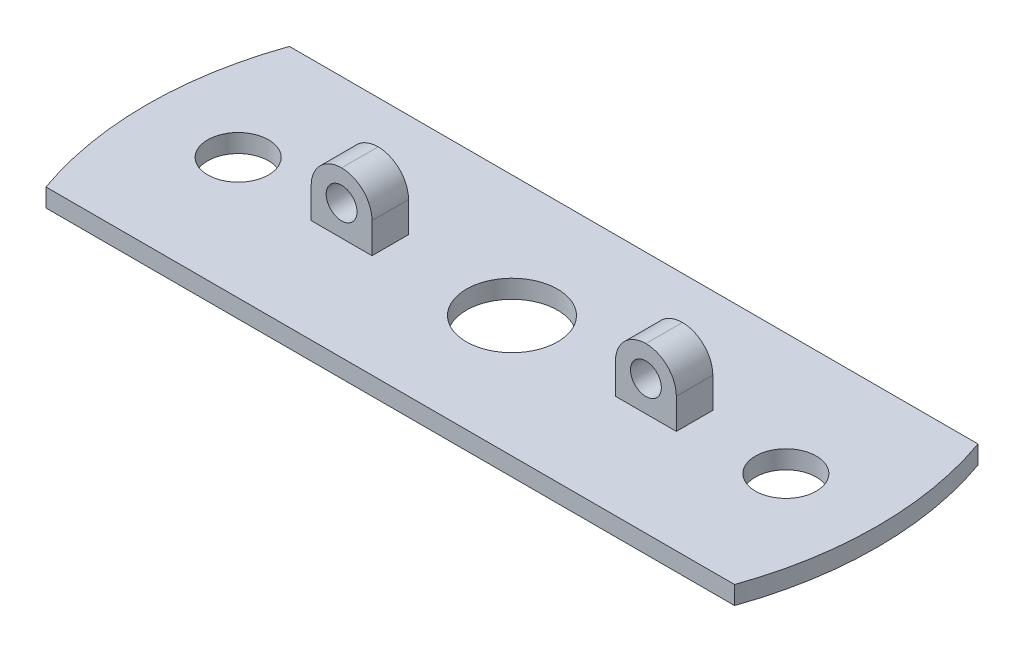
ISO-10303-21;
HEADER;
FILE_DESCRIPTION(('STEP AP214'),'2;1');
FILE_NAME('part.step','',(''),(''),'','','');
FILE_SCHEMA(('AUTOMOTIVE_DESIGN { 1 0 10303 214 1 1 1 1 }'));
ENDSEC;
DATA;
#1=APPLICATION_CONTEXT('core data for automotive mechanical design processes');
#2=APPLICATION_PROTOCOL_DEFINITION('international standard','automotive_design',2000,#1);
#3=PRODUCT_CONTEXT('',#1,'mechanical');
#4=PRODUCT('Part','Part','',(#3));
#5=PRODUCT_RELATED_PRODUCT_CATEGORY('part','',(#4));
#6=PRODUCT_DEFINITION_FORMATION('','',#4);
#7=PRODUCT_DEFINITION_CONTEXT('part definition',#1,'design');
#8=PRODUCT_DEFINITION('design','',#6,#7);
#9=PRODUCT_DEFINITION_SHAPE('','',#8);
#10=(LENGTH_UNIT() NAMED_UNIT(*) SI_UNIT(.MILLI.,.METRE.));
#11=(NAMED_UNIT(*) PLANE_ANGLE_UNIT() SI_UNIT($,.RADIAN.));
#12=(NAMED_UNIT(*) SI_UNIT($,.STERADIAN.) SOLID_ANGLE_UNIT());
#13=UNCERTAINTY_MEASURE_WITH_UNIT(LENGTH_MEASURE(1.E-05),#10,'distance_accuracy_value','');
#14=(GEOMETRIC_REPRESENTATION_CONTEXT(3) GLOBAL_UNCERTAINTY_ASSIGNED_CONTEXT((#13)) GLOBAL_UNIT_ASSIGNED_CONTEXT((#10,
#11,#12)) REPRESENTATION_CONTEXT('',''));
#15=CARTESIAN_POINT('',(0.,0.,0.));
#16=DIRECTION('',(0.,0.,1.));
#17=DIRECTION('',(1.,0.,0.));
#18=AXIS2_PLACEMENT_3D('',#15,#16,#17);
#19=CARTESIAN_POINT('',(0.,3.,0.));
#20=DIRECTION('',(0.,1.,0.));
#21=DIRECTION('',(0.,0.,1.));
#22=AXIS2_PLACEMENT_3D('',#19,#20,#21);
#23=PLANE('',#22);
#24=DIRECTION('',(0.,0.,-1.));
#25=VECTOR('',#24,1.);
#26=CARTESIAN_POINT('',(20.,3.,-3.));
#27=LINE('',#26,#25);
#28=CARTESIAN_POINT('',(20.,3.,3.));
#29=VERTEX_POINT('',#28);
#30=CARTESIAN_POINT('',(20.,3.,-3.));
#31=VERTEX_POINT('',#30);
#32=EDGE_CURVE('E143',#29,#31,#27,.T.);
#33=ORIENTED_EDGE('',*,*,#32,.T.);
#34=DIRECTION('',(1.,0.,0.));
#35=VECTOR('',#34,1.);
#36=CARTESIAN_POINT('',(30.,3.,-3.));
#37=LINE('',#36,#35);
#38=CARTESIAN_POINT('',(30.,3.,-3.));
#39=VERTEX_POINT('',#38);
#40=EDGE_CURVE('E149',#31,#39,#37,.T.);
#41=ORIENTED_EDGE('',*,*,#40,.T.);
#42=DIRECTION('',(0.,0.,1.));
#43=VECTOR('',#42,1.);
#44=CARTESIAN_POINT('',(30.,3.,-3.));
#45=LINE('',#44,#43);
#46=CARTESIAN_POINT('',(30.,3.,3.));
#47=VERTEX_POINT('',#46);
#48=EDGE_CURVE('E162',#39,#47,#45,.T.);
#49=ORIENTED_EDGE('',*,*,#48,.T.);
#50=DIRECTION('',(-1.,0.,0.));
#51=VECTOR('',#50,1.);
#52=CARTESIAN_POINT('',(30.,3.,3.));
#53=LINE('',#52,#51);
#54=EDGE_CURVE('E158',#47,#29,#53,.T.);
#55=ORIENTED_EDGE('',*,*,#54,.T.);
#56=EDGE_LOOP('',(#33,#41,#49,#55));
#57=FACE_BOUND('',#56,.T.);
#58=CARTESIAN_POINT('',(45.,3.,0.));
#59=DIRECTION('',(0.,1.,0.));
#60=DIRECTION('',(0.,0.,1.));
#61=AXIS2_PLACEMENT_3D('',#58,#59,#60);
#62=CIRCLE('',#61,5.);
#63=CARTESIAN_POINT('',(45.,3.,5.));
#64=VERTEX_POINT('',#63);
#65=EDGE_CURVE('E206',#64,#64,#62,.T.);
#66=ORIENTED_EDGE('',*,*,#65,.F.);
#67=EDGE_LOOP('',(#66));
#68=FACE_BOUND('',#67,.T.);
#69=CARTESIAN_POINT('',(0.,3.,0.));
#70=DIRECTION('',(0.,1.,0.));
#71=DIRECTION('',(0.,0.,1.));
#72=AXIS2_PLACEMENT_3D('',#69,#70,#71);
#73=CIRCLE('',#72,60.);
#74=CARTESIAN_POINT('',(-56.5685424949238,3.,-20.));
#75=VERTEX_POINT('',#74);
#76=CARTESIAN_POINT('',(-56.5685424949238,3.,20.));
#77=VERTEX_POINT('',#76);
#78=EDGE_CURVE('E218',#75,#77,#73,.T.);
#79=ORIENTED_EDGE('',*,*,#78,.T.);
#80=DIRECTION('',(1.,0.,0.));
#81=VECTOR('',#80,1.);
#82=CARTESIAN_POINT('',(-56.5685424949238,3.,20.));
#83=LINE('',#82,#81);
#84=CARTESIAN_POINT('',(56.5685424949238,3.,20.));
#85=VERTEX_POINT('',#84);
#86=EDGE_CURVE('E221',#77,#85,#83,.T.);
#87=ORIENTED_EDGE('',*,*,#86,.T.);
#88=CARTESIAN_POINT('',(0.,3.,0.));
#89=DIRECTION('',(0.,1.,0.));
#90=DIRECTION('',(0.,0.,1.));
#91=AXIS2_PLACEMENT_3D('',#88,#89,#90);
#92=CIRCLE('',#91,60.);
#93=CARTESIAN_POINT('',(56.5685424949238,3.,-20.));
#94=VERTEX_POINT('',#93);
#95=EDGE_CURVE('E224',#85,#94,#92,.T.);
#96=ORIENTED_EDGE('',*,*,#95,.T.);
#97=DIRECTION('',(-1.,0.,0.));
#98=VECTOR('',#97,1.);
#99=CARTESIAN_POINT('',(-56.5685424949238,3.,-20.));
#100=LINE('',#99,#98);
#101=EDGE_CURVE('E226',#94,#75,#100,.T.);
#102=ORIENTED_EDGE('',*,*,#101,.T.);
#103=EDGE_LOOP('',(#79,#87,#96,#102));
#104=FACE_BOUND('',#103,.T.);
#105=CARTESIAN_POINT('',(0.,3.,0.));
#106=DIRECTION('',(0.,1.,0.));
#107=DIRECTION('',(0.,0.,1.));
#108=AXIS2_PLACEMENT_3D('',#105,#106,#107);
#109=CIRCLE('',#108,7.5);
#110=CARTESIAN_POINT('',(0.,3.,7.5));
#111=VERTEX_POINT('',#110);
#112=EDGE_CURVE('E212',#111,#111,#109,.T.);
#113=ORIENTED_EDGE('',*,*,#112,.F.);
#114=EDGE_LOOP('',(#113));
#115=FACE_BOUND('',#114,.T.);
#116=CARTESIAN_POINT('',(-45.,3.,0.));
#117=DIRECTION('',(0.,1.,0.));
#118=DIRECTION('',(0.,0.,1.));
#119=AXIS2_PLACEMENT_3D('',#116,#117,#118);
#120=CIRCLE('',#119,5.);
#121=CARTESIAN_POINT('',(-45.,3.,5.));
#122=VERTEX_POINT('',#121);
#123=EDGE_CURVE('E200',#122,#122,#120,.T.);
#124=ORIENTED_EDGE('',*,*,#123,.F.);
#125=EDGE_LOOP('',(#124));
#126=FACE_BOUND('',#125,.T.);
#127=DIRECTION('',(-1.,0.,0.));
#128=VECTOR('',#127,1.);
#129=CARTESIAN_POINT('',(-30.,3.,-3.));
#130=LINE('',#129,#128);
#131=CARTESIAN_POINT('',(-20.,3.,-3.));
#132=VERTEX_POINT('',#131);
#133=CARTESIAN_POINT('',(-30.,3.,-3.));
#134=VERTEX_POINT('',#133);
#135=EDGE_CURVE('E182',#132,#134,#130,.T.);
#136=ORIENTED_EDGE('',*,*,#135,.F.);
#137=DIRECTION('',(0.,0.,-1.));
#138=VECTOR('',#137,1.);
#139=CARTESIAN_POINT('',(-20.,3.,-3.));
#140=LINE('',#139,#138);
#141=CARTESIAN_POINT('',(-20.,3.,3.));
#142=VERTEX_POINT('',#141);
#143=EDGE_CURVE('E179',#142,#132,#140,.T.);
#144=ORIENTED_EDGE('',*,*,#143,.F.);
#145=DIRECTION('',(1.,0.,0.));
#146=VECTOR('',#145,1.);
#147=CARTESIAN_POINT('',(-30.,3.,3.));
#148=LINE('',#147,#146);
#149=CARTESIAN_POINT('',(-30.,3.,3.));
#150=VERTEX_POINT('',#149);
#151=EDGE_CURVE('E188',#150,#142,#148,.T.);
#152=ORIENTED_EDGE('',*,*,#151,.F.);
#153=DIRECTION('',(0.,0.,1.));
#154=VECTOR('',#153,1.);
#155=CARTESIAN_POINT('',(-30.,3.,-3.));
#156=LINE('',#155,#154);
#157=EDGE_CURVE('E185',#134,#150,#156,.T.);
#158=ORIENTED_EDGE('',*,*,#157,.F.);
#159=EDGE_LOOP('',(#136,#144,#152,#158));
#160=FACE_BOUND('',#159,.T.);
#161=ADVANCED_FACE('F37',(#57,#68,#104,#115,#126,#160),#23,.T.);
#162=CARTESIAN_POINT('',(0.,0.,0.));
#163=DIRECTION('',(0.,1.,0.));
#164=DIRECTION('',(0.,0.,1.));
#165=AXIS2_PLACEMENT_3D('',#162,#163,#164);
#166=PLANE('',#165);
#167=CARTESIAN_POINT('',(0.,0.,0.));
#168=DIRECTION('',(0.,1.,0.));
#169=DIRECTION('',(0.,0.,1.));
#170=AXIS2_PLACEMENT_3D('',#167,#168,#169);
#171=CIRCLE('',#170,60.);
#172=CARTESIAN_POINT('',(-56.5685424949238,0.,-20.));
#173=VERTEX_POINT('',#172);
#174=CARTESIAN_POINT('',(-56.5685424949238,0.,20.));
#175=VERTEX_POINT('',#174);
#176=EDGE_CURVE('E215',#173,#175,#171,.T.);
#177=ORIENTED_EDGE('',*,*,#176,.F.);
#178=DIRECTION('',(-1.,0.,0.));
#179=VECTOR('',#178,1.);
#180=CARTESIAN_POINT('',(-56.5685424949238,0.,-20.));
#181=LINE('',#180,#179);
#182=CARTESIAN_POINT('',(56.5685424949238,0.,-20.));
#183=VERTEX_POINT('',#182);
#184=EDGE_CURVE('E222',#183,#173,#181,.T.);
#185=ORIENTED_EDGE('',*,*,#184,.F.);
#186=CARTESIAN_POINT('',(0.,0.,0.));
#187=DIRECTION('',(0.,1.,0.));
#188=DIRECTION('',(0.,0.,1.));
#189=AXIS2_PLACEMENT_3D('',#186,#187,#188);
#190=CIRCLE('',#189,60.);
#191=CARTESIAN_POINT('',(56.5685424949238,0.,20.));
#192=VERTEX_POINT('',#191);
#193=EDGE_CURVE('E233',#192,#183,#190,.T.);
#194=ORIENTED_EDGE('',*,*,#193,.F.);
#195=DIRECTION('',(1.,0.,0.));
#196=VECTOR('',#195,1.);
#197=CARTESIAN_POINT('',(-56.5685424949238,0.,20.));
#198=LINE('',#197,#196);
#199=EDGE_CURVE('E231',#175,#192,#198,.T.);
#200=ORIENTED_EDGE('',*,*,#199,.F.);
#201=EDGE_LOOP('',(#177,#185,#194,#200));
#202=FACE_BOUND('',#201,.T.);
#203=CARTESIAN_POINT('',(0.,0.,0.));
#204=DIRECTION('',(0.,1.,0.));
#205=DIRECTION('',(0.,0.,1.));
#206=AXIS2_PLACEMENT_3D('',#203,#204,#205);
#207=CIRCLE('',#206,7.5);
#208=CARTESIAN_POINT('',(0.,0.,7.5));
#209=VERTEX_POINT('',#208);
#210=EDGE_CURVE('E209',#209,#209,#207,.T.);
#211=ORIENTED_EDGE('',*,*,#210,.T.);
#212=EDGE_LOOP('',(#211));
#213=FACE_BOUND('',#212,.T.);
#214=CARTESIAN_POINT('',(45.,0.,0.));
#215=DIRECTION('',(0.,1.,0.));
#216=DIRECTION('',(0.,0.,1.));
#217=AXIS2_PLACEMENT_3D('',#214,#215,#216);
#218=CIRCLE('',#217,5.);
#219=CARTESIAN_POINT('',(45.,0.,5.));
#220=VERTEX_POINT('',#219);
#221=EDGE_CURVE('E203',#220,#220,#218,.T.);
#222=ORIENTED_EDGE('',*,*,#221,.T.);
#223=EDGE_LOOP('',(#222));
#224=FACE_BOUND('',#223,.T.);
#225=CARTESIAN_POINT('',(-45.,0.,0.));
#226=DIRECTION('',(0.,1.,0.));
#227=DIRECTION('',(0.,0.,1.));
#228=AXIS2_PLACEMENT_3D('',#225,#226,#227);
#229=CIRCLE('',#228,5.);
#230=CARTESIAN_POINT('',(-45.,0.,5.));
#231=VERTEX_POINT('',#230);
#232=EDGE_CURVE('E199',#231,#231,#229,.T.);
#233=ORIENTED_EDGE('',*,*,#232,.T.);
#234=EDGE_LOOP('',(#233));
#235=FACE_BOUND('',#234,.T.);
#236=ADVANCED_FACE('F296',(#202,#213,#224,#235),#166,.F.);
#237=CARTESIAN_POINT('',(0.,3.,0.));
#238=DIRECTION('',(0.,-1.,0.));
#239=DIRECTION('',(0.,0.,-1.));
#240=AXIS2_PLACEMENT_3D('',#237,#238,#239);
#241=CYLINDRICAL_SURFACE('',#240,60.);
#242=ORIENTED_EDGE('',*,*,#176,.T.);
#243=DIRECTION('',(0.,-1.,0.));
#244=VECTOR('',#243,1.);
#245=CARTESIAN_POINT('',(-56.5685424949238,3.,20.));
#246=LINE('',#245,#244);
#247=EDGE_CURVE('E244',#77,#175,#246,.T.);
#248=ORIENTED_EDGE('',*,*,#247,.F.);
#249=ORIENTED_EDGE('',*,*,#78,.F.);
#250=DIRECTION('',(0.,-1.,0.));
#251=VECTOR('',#250,1.);
#252=CARTESIAN_POINT('',(-56.5685424949238,3.,-20.));
#253=LINE('',#252,#251);
#254=EDGE_CURVE('E228',#75,#173,#253,.T.);
#255=ORIENTED_EDGE('',*,*,#254,.T.);
#256=EDGE_LOOP('',(#242,#248,#249,#255));
#257=FACE_BOUND('',#256,.T.);
#258=ADVANCED_FACE('F301',(#257),#241,.T.);
#259=CARTESIAN_POINT('',(-56.5685424949238,3.,20.));
#260=DIRECTION('',(0.,0.,-1.));
#261=DIRECTION('',(-1.,0.,0.));
#262=AXIS2_PLACEMENT_3D('',#259,#260,#261);
#263=PLANE('',#262);
#264=ORIENTED_EDGE('',*,*,#199,.T.);
#265=DIRECTION('',(0.,-1.,0.));
#266=VECTOR('',#265,1.);
#267=CARTESIAN_POINT('',(56.5685424949238,3.,20.));
#268=LINE('',#267,#266);
#269=EDGE_CURVE('E241',#85,#192,#268,.T.);
#270=ORIENTED_EDGE('',*,*,#269,.F.);
#271=ORIENTED_EDGE('',*,*,#86,.F.);
#272=ORIENTED_EDGE('',*,*,#247,.T.);
#273=EDGE_LOOP('',(#264,#270,#271,#272));
#274=FACE_BOUND('',#273,.T.);
#275=ADVANCED_FACE('F315',(#274),#263,.F.);
#276=CARTESIAN_POINT('',(0.,3.,0.));
#277=DIRECTION('',(0.,-1.,0.));
#278=DIRECTION('',(0.,0.,-1.));
#279=AXIS2_PLACEMENT_3D('',#276,#277,#278);
#280=CYLINDRICAL_SURFACE('',#279,60.);
#281=ORIENTED_EDGE('',*,*,#193,.T.);
#282=DIRECTION('',(0.,-1.,0.));
#283=VECTOR('',#282,1.);
#284=CARTESIAN_POINT('',(56.5685424949238,3.,-20.));
#285=LINE('',#284,#283);
#286=EDGE_CURVE('E238',#94,#183,#285,.T.);
#287=ORIENTED_EDGE('',*,*,#286,.F.);
#288=ORIENTED_EDGE('',*,*,#95,.F.);
#289=ORIENTED_EDGE('',*,*,#269,.T.);
#290=EDGE_LOOP('',(#281,#287,#288,#289));
#291=FACE_BOUND('',#290,.T.);
#292=ADVANCED_FACE('F311',(#291),#280,.T.);
#293=CARTESIAN_POINT('',(-56.5685424949238,3.,-20.));
#294=DIRECTION('',(0.,0.,1.));
#295=DIRECTION('',(1.,0.,0.));
#296=AXIS2_PLACEMENT_3D('',#293,#294,#295);
#297=PLANE('',#296);
#298=ORIENTED_EDGE('',*,*,#184,.T.);
#299=ORIENTED_EDGE('',*,*,#254,.F.);
#300=ORIENTED_EDGE('',*,*,#101,.F.);
#301=ORIENTED_EDGE('',*,*,#286,.T.);
#302=EDGE_LOOP('',(#298,#299,#300,#301));
#303=FACE_BOUND('',#302,.T.);
#304=ADVANCED_FACE('F308',(#303),#297,.F.);
#305=CARTESIAN_POINT('',(0.,3.,0.));
#306=DIRECTION('',(0.,-1.,0.));
#307=DIRECTION('',(0.,0.,-1.));
#308=AXIS2_PLACEMENT_3D('',#305,#306,#307);
#309=CYLINDRICAL_SURFACE('',#308,7.5);
#310=ORIENTED_EDGE('',*,*,#112,.T.);
#311=EDGE_LOOP('',(#310));
#312=FACE_BOUND('',#311,.T.);
#313=ORIENTED_EDGE('',*,*,#210,.F.);
#314=EDGE_LOOP('',(#313));
#315=FACE_BOUND('',#314,.T.);
#316=ADVANCED_FACE('F305',(#312,#315),#309,.F.);
#317=CARTESIAN_POINT('',(45.,3.,0.));
#318=DIRECTION('',(0.,-1.,0.));
#319=DIRECTION('',(0.,0.,-1.));
#320=AXIS2_PLACEMENT_3D('',#317,#318,#319);
#321=CYLINDRICAL_SURFACE('',#320,5.);
#322=ORIENTED_EDGE('',*,*,#65,.T.);
#323=EDGE_LOOP('',(#322));
#324=FACE_BOUND('',#323,.T.);
#325=ORIENTED_EDGE('',*,*,#221,.F.);
#326=EDGE_LOOP('',(#325));
#327=FACE_BOUND('',#326,.T.);
#328=ADVANCED_FACE('F447',(#324,#327),#321,.F.);
#329=CARTESIAN_POINT('',(-45.,3.,0.));
#330=DIRECTION('',(0.,-1.,0.));
#331=DIRECTION('',(0.,0.,-1.));
#332=AXIS2_PLACEMENT_3D('',#329,#330,#331);
#333=CYLINDRICAL_SURFACE('',#332,5.);
#334=ORIENTED_EDGE('',*,*,#123,.T.);
#335=EDGE_LOOP('',(#334));
#336=FACE_BOUND('',#335,.T.);
#337=ORIENTED_EDGE('',*,*,#232,.F.);
#338=EDGE_LOOP('',(#337));
#339=FACE_BOUND('',#338,.T.);
#340=ADVANCED_FACE('F431',(#336,#339),#333,.F.);
#341=CARTESIAN_POINT('',(-20.,13.,-3.));
#342=DIRECTION('',(-1.,0.,0.));
#343=DIRECTION('',(0.,0.,1.));
#344=AXIS2_PLACEMENT_3D('',#341,#342,#343);
#345=PLANE('',#344);
#346=DIRECTION('',(0.,-1.,0.));
#347=VECTOR('',#346,1.);
#348=CARTESIAN_POINT('',(-20.,13.,-3.));
#349=LINE('',#348,#347);
#350=CARTESIAN_POINT('',(-20.,8.,-3.));
#351=VERTEX_POINT('',#350);
#352=EDGE_CURVE('E197',#351,#132,#349,.T.);
#353=ORIENTED_EDGE('',*,*,#352,.F.);
#354=DIRECTION('',(0.,0.,-1.));
#355=VECTOR('',#354,1.);
#356=CARTESIAN_POINT('',(-20.,8.,3.));
#357=LINE('',#356,#355);
#358=CARTESIAN_POINT('',(-20.,8.,3.));
#359=VERTEX_POINT('',#358);
#360=EDGE_CURVE('E251',#351,#359,#357,.F.);
#361=ORIENTED_EDGE('',*,*,#360,.T.);
#362=DIRECTION('',(0.,-1.,0.));
#363=VECTOR('',#362,1.);
#364=CARTESIAN_POINT('',(-20.,13.,3.));
#365=LINE('',#364,#363);
#366=EDGE_CURVE('E191',#359,#142,#365,.T.);
#367=ORIENTED_EDGE('',*,*,#366,.T.);
#368=ORIENTED_EDGE('',*,*,#143,.T.);
#369=EDGE_LOOP('',(#353,#361,#367,#368));
#370=FACE_BOUND('',#369,.T.);
#371=ADVANCED_FACE('F422',(#370),#345,.F.);
#372=CARTESIAN_POINT('',(-30.,13.,-3.));
#373=DIRECTION('',(0.,0.,1.));
#374=DIRECTION('',(1.,0.,0.));
#375=AXIS2_PLACEMENT_3D('',#372,#373,#374);
#376=PLANE('',#375);
#377=CARTESIAN_POINT('',(-25.,8.,-3.));
#378=DIRECTION('',(0.,0.,1.));
#379=DIRECTION('',(1.,0.,0.));
#380=AXIS2_PLACEMENT_3D('',#377,#378,#379);
#381=CIRCLE('',#380,2.53473554687856);
#382=CARTESIAN_POINT('',(-22.4652644531214,8.,-3.));
#383=VERTEX_POINT('',#382);
#384=EDGE_CURVE('E176',#383,#383,#381,.T.);
#385=ORIENTED_EDGE('',*,*,#384,.T.);
#386=EDGE_LOOP('',(#385));
#387=FACE_BOUND('',#386,.T.);
#388=CARTESIAN_POINT('',(-25.,8.,-3.));
#389=DIRECTION('',(0.,0.,1.));
#390=DIRECTION('',(1.,0.,0.));
#391=AXIS2_PLACEMENT_3D('',#388,#389,#390);
#392=CIRCLE('',#391,5.);
#393=CARTESIAN_POINT('',(-30.,8.,-3.));
#394=VERTEX_POINT('',#393);
#395=CARTESIAN_POINT('',(-25.,13.,-3.));
#396=VERTEX_POINT('',#395);
#397=EDGE_CURVE('E247',#394,#396,#392,.F.);
#398=ORIENTED_EDGE('',*,*,#397,.T.);
#399=CARTESIAN_POINT('',(-25.,8.,-3.));
#400=DIRECTION('',(0.,0.,1.));
#401=DIRECTION('',(1.,0.,0.));
#402=AXIS2_PLACEMENT_3D('',#399,#400,#401);
#403=CIRCLE('',#402,5.);
#404=EDGE_CURVE('E249',#396,#351,#403,.F.);
#405=ORIENTED_EDGE('',*,*,#404,.T.);
#406=ORIENTED_EDGE('',*,*,#352,.T.);
#407=ORIENTED_EDGE('',*,*,#135,.T.);
#408=DIRECTION('',(0.,-1.,0.));
#409=VECTOR('',#408,1.);
#410=CARTESIAN_POINT('',(-30.,13.,-3.));
#411=LINE('',#410,#409);
#412=EDGE_CURVE('E195',#394,#134,#411,.T.);
#413=ORIENTED_EDGE('',*,*,#412,.F.);
#414=EDGE_LOOP('',(#398,#405,#406,#407,#413));
#415=FACE_BOUND('',#414,.T.);
#416=ADVANCED_FACE('F412',(#387,#415),#376,.F.);
#417=CARTESIAN_POINT('',(-30.,13.,-3.));
#418=DIRECTION('',(1.,0.,0.));
#419=DIRECTION('',(0.,0.,-1.));
#420=AXIS2_PLACEMENT_3D('',#417,#418,#419);
#421=PLANE('',#420);
#422=DIRECTION('',(0.,-1.,0.));
#423=VECTOR('',#422,1.);
#424=CARTESIAN_POINT('',(-30.,13.,3.));
#425=LINE('',#424,#423);
#426=CARTESIAN_POINT('',(-30.,8.,3.));
#427=VERTEX_POINT('',#426);
#428=EDGE_CURVE('E193',#427,#150,#425,.T.);
#429=ORIENTED_EDGE('',*,*,#428,.F.);
#430=DIRECTION('',(0.,0.,1.));
#431=VECTOR('',#430,1.);
#432=CARTESIAN_POINT('',(-30.,8.,-3.));
#433=LINE('',#432,#431);
#434=EDGE_CURVE('E258',#427,#394,#433,.F.);
#435=ORIENTED_EDGE('',*,*,#434,.T.);
#436=ORIENTED_EDGE('',*,*,#412,.T.);
#437=ORIENTED_EDGE('',*,*,#157,.T.);
#438=EDGE_LOOP('',(#429,#435,#436,#437));
#439=FACE_BOUND('',#438,.T.);
#440=ADVANCED_FACE('F402',(#439),#421,.F.);
#441=CARTESIAN_POINT('',(-30.,13.,3.));
#442=DIRECTION('',(0.,0.,-1.));
#443=DIRECTION('',(-1.,0.,0.));
#444=AXIS2_PLACEMENT_3D('',#441,#442,#443);
#445=PLANE('',#444);
#446=CARTESIAN_POINT('',(-25.,8.,3.));
#447=DIRECTION('',(0.,0.,1.));
#448=DIRECTION('',(1.,0.,0.));
#449=AXIS2_PLACEMENT_3D('',#446,#447,#448);
#450=CIRCLE('',#449,2.53473554687856);
#451=CARTESIAN_POINT('',(-22.4652644531214,8.,3.));
#452=VERTEX_POINT('',#451);
#453=EDGE_CURVE('E173',#452,#452,#450,.T.);
#454=ORIENTED_EDGE('',*,*,#453,.F.);
#455=EDGE_LOOP('',(#454));
#456=FACE_BOUND('',#455,.T.);
#457=ORIENTED_EDGE('',*,*,#366,.F.);
#458=CARTESIAN_POINT('',(-25.,8.,3.));
#459=DIRECTION('',(0.,0.,-1.));
#460=DIRECTION('',(-1.,0.,0.));
#461=AXIS2_PLACEMENT_3D('',#458,#459,#460);
#462=CIRCLE('',#461,5.);
#463=CARTESIAN_POINT('',(-25.,13.,3.));
#464=VERTEX_POINT('',#463);
#465=EDGE_CURVE('E256',#359,#464,#462,.F.);
#466=ORIENTED_EDGE('',*,*,#465,.T.);
#467=CARTESIAN_POINT('',(-25.,8.,3.));
#468=DIRECTION('',(0.,0.,-1.));
#469=DIRECTION('',(-1.,0.,0.));
#470=AXIS2_PLACEMENT_3D('',#467,#468,#469);
#471=CIRCLE('',#470,5.);
#472=EDGE_CURVE('E254',#464,#427,#471,.F.);
#473=ORIENTED_EDGE('',*,*,#472,.T.);
#474=ORIENTED_EDGE('',*,*,#428,.T.);
#475=ORIENTED_EDGE('',*,*,#151,.T.);
#476=EDGE_LOOP('',(#457,#466,#473,#474,#475));
#477=FACE_BOUND('',#476,.T.);
#478=ADVANCED_FACE('F397',(#456,#477),#445,.F.);
#479=CARTESIAN_POINT('',(-25.,8.,-6.));
#480=DIRECTION('',(0.,0.,1.));
#481=DIRECTION('',(1.,0.,0.));
#482=AXIS2_PLACEMENT_3D('',#479,#480,#481);
#483=CYLINDRICAL_SURFACE('',#482,2.53473554687856);
#484=ORIENTED_EDGE('',*,*,#453,.T.);
#485=EDGE_LOOP('',(#484));
#486=FACE_BOUND('',#485,.T.);
#487=ORIENTED_EDGE('',*,*,#384,.F.);
#488=EDGE_LOOP('',(#487));
#489=FACE_BOUND('',#488,.T.);
#490=ADVANCED_FACE('F329',(#486,#489),#483,.F.);
#491=CARTESIAN_POINT('',(-25.,8.,0.));
#492=DIRECTION('',(0.,0.,-1.));
#493=DIRECTION('',(-1.,0.,0.));
#494=AXIS2_PLACEMENT_3D('',#491,#492,#493);
#495=CYLINDRICAL_SURFACE('',#494,5.);
#496=ORIENTED_EDGE('',*,*,#434,.F.);
#497=ORIENTED_EDGE('',*,*,#472,.F.);
#498=DIRECTION('',(0.,0.,1.));
#499=VECTOR('',#498,1.);
#500=CARTESIAN_POINT('',(-25.,13.,3.));
#501=LINE('',#500,#499);
#502=EDGE_CURVE('E172',#396,#464,#501,.T.);
#503=ORIENTED_EDGE('',*,*,#502,.F.);
#504=ORIENTED_EDGE('',*,*,#397,.F.);
#505=EDGE_LOOP('',(#496,#497,#503,#504));
#506=FACE_BOUND('',#505,.T.);
#507=ADVANCED_FACE('F326',(#506),#495,.T.);
#508=CARTESIAN_POINT('',(-25.,8.,0.));
#509=DIRECTION('',(0.,0.,1.));
#510=DIRECTION('',(1.,0.,0.));
#511=AXIS2_PLACEMENT_3D('',#508,#509,#510);
#512=CYLINDRICAL_SURFACE('',#511,5.);
#513=ORIENTED_EDGE('',*,*,#465,.F.);
#514=ORIENTED_EDGE('',*,*,#360,.F.);
#515=ORIENTED_EDGE('',*,*,#404,.F.);
#516=ORIENTED_EDGE('',*,*,#502,.T.);
#517=EDGE_LOOP('',(#513,#514,#515,#516));
#518=FACE_BOUND('',#517,.T.);
#519=ADVANCED_FACE('F323',(#518),#512,.T.);
#520=CARTESIAN_POINT('',(20.,13.,-3.));
#521=DIRECTION('',(-1.,0.,0.));
#522=DIRECTION('',(0.,0.,1.));
#523=AXIS2_PLACEMENT_3D('',#520,#521,#522);
#524=PLANE('',#523);
#525=DIRECTION('',(0.,-1.,0.));
#526=VECTOR('',#525,1.);
#527=CARTESIAN_POINT('',(20.,13.,3.));
#528=LINE('',#527,#526);
#529=CARTESIAN_POINT('',(20.,8.,3.));
#530=VERTEX_POINT('',#529);
#531=EDGE_CURVE('E170',#530,#29,#528,.T.);
#532=ORIENTED_EDGE('',*,*,#531,.F.);
#533=DIRECTION('',(0.,0.,-1.));
#534=VECTOR('',#533,1.);
#535=CARTESIAN_POINT('',(20.,8.,-3.));
#536=LINE('',#535,#534);
#537=CARTESIAN_POINT('',(20.,8.,-3.));
#538=VERTEX_POINT('',#537);
#539=EDGE_CURVE('E145',#530,#538,#536,.T.);
#540=ORIENTED_EDGE('',*,*,#539,.T.);
#541=DIRECTION('',(0.,-1.,0.));
#542=VECTOR('',#541,1.);
#543=CARTESIAN_POINT('',(20.,13.,-3.));
#544=LINE('',#543,#542);
#545=EDGE_CURVE('E139',#538,#31,#544,.T.);
#546=ORIENTED_EDGE('',*,*,#545,.T.);
#547=ORIENTED_EDGE('',*,*,#32,.F.);
#548=EDGE_LOOP('',(#532,#540,#546,#547));
#549=FACE_BOUND('',#548,.T.);
#550=ADVANCED_FACE('F142',(#549),#524,.T.);
#551=CARTESIAN_POINT('',(30.,13.,3.));
#552=DIRECTION('',(0.,0.,1.));
#553=DIRECTION('',(1.,0.,0.));
#554=AXIS2_PLACEMENT_3D('',#551,#552,#553);
#555=PLANE('',#554);
#556=CARTESIAN_POINT('',(25.,8.,3.));
#557=DIRECTION('',(0.,0.,-1.));
#558=DIRECTION('',(-1.,0.,0.));
#559=AXIS2_PLACEMENT_3D('',#556,#557,#558);
#560=CIRCLE('',#559,2.53473554687856);
#561=CARTESIAN_POINT('',(22.4652644531214,8.,3.));
#562=VERTEX_POINT('',#561);
#563=EDGE_CURVE('E264',#562,#562,#560,.T.);
#564=ORIENTED_EDGE('',*,*,#563,.T.);
#565=EDGE_LOOP('',(#564));
#566=FACE_BOUND('',#565,.T.);
#567=CARTESIAN_POINT('',(25.,8.,3.));
#568=DIRECTION('',(0.,0.,1.));
#569=DIRECTION('',(1.,0.,0.));
#570=AXIS2_PLACEMENT_3D('',#567,#568,#569);
#571=CIRCLE('',#570,5.);
#572=CARTESIAN_POINT('',(30.,8.,3.));
#573=VERTEX_POINT('',#572);
#574=CARTESIAN_POINT('',(25.,13.,3.));
#575=VERTEX_POINT('',#574);
#576=EDGE_CURVE('E53',#573,#575,#571,.T.);
#577=ORIENTED_EDGE('',*,*,#576,.T.);
#578=CARTESIAN_POINT('',(25.,8.,3.));
#579=DIRECTION('',(0.,0.,1.));
#580=DIRECTION('',(1.,0.,0.));
#581=AXIS2_PLACEMENT_3D('',#578,#579,#580);
#582=CIRCLE('',#581,5.);
#583=EDGE_CURVE('E46',#575,#530,#582,.T.);
#584=ORIENTED_EDGE('',*,*,#583,.T.);
#585=ORIENTED_EDGE('',*,*,#531,.T.);
#586=ORIENTED_EDGE('',*,*,#54,.F.);
#587=DIRECTION('',(0.,-1.,0.));
#588=VECTOR('',#587,1.);
#589=CARTESIAN_POINT('',(30.,13.,3.));
#590=LINE('',#589,#588);
#591=EDGE_CURVE('E168',#573,#47,#590,.T.);
#592=ORIENTED_EDGE('',*,*,#591,.F.);
#593=EDGE_LOOP('',(#577,#584,#585,#586,#592));
#594=FACE_BOUND('',#593,.T.);
#595=ADVANCED_FACE('F272',(#566,#594),#555,.T.);
#596=CARTESIAN_POINT('',(30.,13.,-3.));
#597=DIRECTION('',(1.,0.,0.));
#598=DIRECTION('',(0.,0.,-1.));
#599=AXIS2_PLACEMENT_3D('',#596,#597,#598);
#600=PLANE('',#599);
#601=DIRECTION('',(0.,-1.,0.));
#602=VECTOR('',#601,1.);
#603=CARTESIAN_POINT('',(30.,13.,-3.));
#604=LINE('',#603,#602);
#605=CARTESIAN_POINT('',(30.,8.,-3.));
#606=VERTEX_POINT('',#605);
#607=EDGE_CURVE('E148',#606,#39,#604,.T.);
#608=ORIENTED_EDGE('',*,*,#607,.F.);
#609=DIRECTION('',(0.,0.,1.));
#610=VECTOR('',#609,1.);
#611=CARTESIAN_POINT('',(30.,8.,-3.));
#612=LINE('',#611,#610);
#613=EDGE_CURVE('E11',#606,#573,#612,.T.);
#614=ORIENTED_EDGE('',*,*,#613,.T.);
#615=ORIENTED_EDGE('',*,*,#591,.T.);
#616=ORIENTED_EDGE('',*,*,#48,.F.);
#617=EDGE_LOOP('',(#608,#614,#615,#616));
#618=FACE_BOUND('',#617,.T.);
#619=ADVANCED_FACE('F291',(#618),#600,.T.);
#620=CARTESIAN_POINT('',(30.,13.,-3.));
#621=DIRECTION('',(0.,0.,-1.));
#622=DIRECTION('',(-1.,0.,0.));
#623=AXIS2_PLACEMENT_3D('',#620,#621,#622);
#624=PLANE('',#623);
#625=CARTESIAN_POINT('',(25.,8.,-3.));
#626=DIRECTION('',(0.,0.,-1.));
#627=DIRECTION('',(-1.,0.,0.));
#628=AXIS2_PLACEMENT_3D('',#625,#626,#627);
#629=CIRCLE('',#628,2.53473554687856);
#630=CARTESIAN_POINT('',(22.4652644531214,8.,-3.));
#631=VERTEX_POINT('',#630);
#632=EDGE_CURVE('E159',#631,#631,#629,.F.);
#633=ORIENTED_EDGE('',*,*,#632,.T.);
#634=EDGE_LOOP('',(#633));
#635=FACE_BOUND('',#634,.T.);
#636=ORIENTED_EDGE('',*,*,#545,.F.);
#637=CARTESIAN_POINT('',(25.,8.,-3.));
#638=DIRECTION('',(0.,0.,-1.));
#639=DIRECTION('',(-1.,0.,0.));
#640=AXIS2_PLACEMENT_3D('',#637,#638,#639);
#641=CIRCLE('',#640,5.);
#642=CARTESIAN_POINT('',(25.,13.,-3.));
#643=VERTEX_POINT('',#642);
#644=EDGE_CURVE('E268',#538,#643,#641,.T.);
#645=ORIENTED_EDGE('',*,*,#644,.T.);
#646=CARTESIAN_POINT('',(25.,8.,-3.));
#647=DIRECTION('',(0.,0.,-1.));
#648=DIRECTION('',(-1.,0.,0.));
#649=AXIS2_PLACEMENT_3D('',#646,#647,#648);
#650=CIRCLE('',#649,5.);
#651=EDGE_CURVE('E266',#643,#606,#650,.T.);
#652=ORIENTED_EDGE('',*,*,#651,.T.);
#653=ORIENTED_EDGE('',*,*,#607,.T.);
#654=ORIENTED_EDGE('',*,*,#40,.F.);
#655=EDGE_LOOP('',(#636,#645,#652,#653,#654));
#656=FACE_BOUND('',#655,.T.);
#657=ADVANCED_FACE('F161',(#635,#656),#624,.T.);
#658=CARTESIAN_POINT('',(25.,8.,-6.));
#659=DIRECTION('',(0.,0.,1.));
#660=DIRECTION('',(1.,0.,0.));
#661=AXIS2_PLACEMENT_3D('',#658,#659,#660);
#662=CYLINDRICAL_SURFACE('',#661,2.53473554687856);
#663=ORIENTED_EDGE('',*,*,#632,.F.);
#664=EDGE_LOOP('',(#663));
#665=FACE_BOUND('',#664,.T.);
#666=ORIENTED_EDGE('',*,*,#563,.F.);
#667=EDGE_LOOP('',(#666));
#668=FACE_BOUND('',#667,.T.);
#669=ADVANCED_FACE('F283',(#665,#668),#662,.F.);
#670=CARTESIAN_POINT('',(25.,8.,-3.));
#671=DIRECTION('',(0.,0.,1.));
#672=DIRECTION('',(1.,0.,0.));
#673=AXIS2_PLACEMENT_3D('',#670,#671,#672);
#674=CYLINDRICAL_SURFACE('',#673,5.);
#675=DIRECTION('',(0.,0.,1.));
#676=VECTOR('',#675,1.);
#677=CARTESIAN_POINT('',(25.,13.,0.));
#678=LINE('',#677,#676);
#679=EDGE_CURVE('E41',#575,#643,#678,.F.);
#680=ORIENTED_EDGE('',*,*,#679,.F.);
#681=ORIENTED_EDGE('',*,*,#576,.F.);
#682=ORIENTED_EDGE('',*,*,#613,.F.);
#683=ORIENTED_EDGE('',*,*,#651,.F.);
#684=EDGE_LOOP('',(#680,#681,#682,#683));
#685=FACE_BOUND('',#684,.T.);
#686=ADVANCED_FACE('F39',(#685),#674,.T.);
#687=CARTESIAN_POINT('',(25.,8.,-3.));
#688=DIRECTION('',(0.,0.,-1.));
#689=DIRECTION('',(-1.,0.,0.));
#690=AXIS2_PLACEMENT_3D('',#687,#688,#689);
#691=CYLINDRICAL_SURFACE('',#690,5.);
#692=ORIENTED_EDGE('',*,*,#583,.F.);
#693=ORIENTED_EDGE('',*,*,#679,.T.);
#694=ORIENTED_EDGE('',*,*,#644,.F.);
#695=ORIENTED_EDGE('',*,*,#539,.F.);
#696=EDGE_LOOP('',(#692,#693,#694,#695));
#697=FACE_BOUND('',#696,.T.);
#698=ADVANCED_FACE('F275',(#697),#691,.T.);
#699=CLOSED_SHELL('',(#161,#236,#258,#275,#292,#304,#316,#328,#340,#371,#416,#440,#478,#490,
#507,#519,#550,#595,#619,#657,#669,#686,#698));
#700=MANIFOLD_SOLID_BREP('B2',#699);
#701=ADVANCED_BREP_SHAPE_REPRESENTATION('',(#18,#700),#14);
#702=SHAPE_DEFINITION_REPRESENTATION(#9,#701);
ENDSEC;
END-ISO-10303-21;
